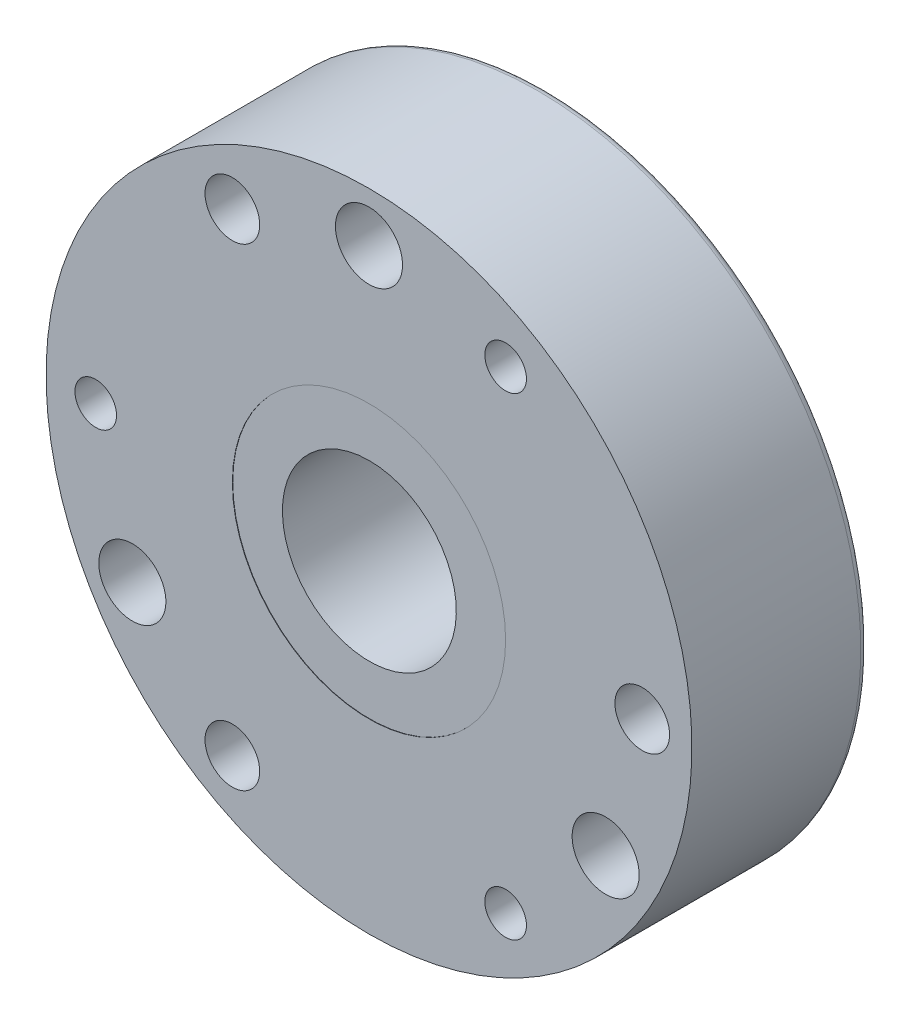
ISO-10303-21;
HEADER;
FILE_DESCRIPTION(('STEP AP214'),'2;1');
FILE_NAME('part.step','',(''),(''),'','','');
FILE_SCHEMA(('AUTOMOTIVE_DESIGN { 1 0 10303 214 1 1 1 1 }'));
ENDSEC;
DATA;
#1=APPLICATION_CONTEXT('core data for automotive mechanical design processes');
#2=APPLICATION_PROTOCOL_DEFINITION('international standard','automotive_design',2000,#1);
#3=PRODUCT_CONTEXT('',#1,'mechanical');
#4=PRODUCT('Part','Part','',(#3));
#5=PRODUCT_RELATED_PRODUCT_CATEGORY('part','',(#4));
#6=PRODUCT_DEFINITION_FORMATION('','',#4);
#7=PRODUCT_DEFINITION_CONTEXT('part definition',#1,'design');
#8=PRODUCT_DEFINITION('design','',#6,#7);
#9=PRODUCT_DEFINITION_SHAPE('','',#8);
#10=(LENGTH_UNIT() NAMED_UNIT(*) SI_UNIT(.MILLI.,.METRE.));
#11=(NAMED_UNIT(*) PLANE_ANGLE_UNIT() SI_UNIT($,.RADIAN.));
#12=(NAMED_UNIT(*) SI_UNIT($,.STERADIAN.) SOLID_ANGLE_UNIT());
#13=UNCERTAINTY_MEASURE_WITH_UNIT(LENGTH_MEASURE(1.E-05),#10,'distance_accuracy_value','');
#14=(GEOMETRIC_REPRESENTATION_CONTEXT(3) GLOBAL_UNCERTAINTY_ASSIGNED_CONTEXT((#13)) GLOBAL_UNIT_ASSIGNED_CONTEXT((#10,
#11,#12)) REPRESENTATION_CONTEXT('',''));
#15=CARTESIAN_POINT('',(0.,0.,0.));
#16=DIRECTION('',(0.,0.,1.));
#17=DIRECTION('',(1.,0.,0.));
#18=AXIS2_PLACEMENT_3D('',#15,#16,#17);
#19=CARTESIAN_POINT('',(0.,-14.35,6.85));
#20=DIRECTION('',(0.,0.,1.));
#21=DIRECTION('',(1.,0.,0.));
#22=AXIS2_PLACEMENT_3D('',#19,#20,#21);
#23=PLANE('',#22);
#24=CARTESIAN_POINT('',(0.,-1.35,6.85));
#25=DIRECTION('',(0.,0.,1.));
#26=DIRECTION('',(0.,-1.,0.));
#27=AXIS2_PLACEMENT_3D('',#24,#25,#26);
#28=CIRCLE('',#27,13.);
#29=CARTESIAN_POINT('',(0.,-14.35,6.85));
#30=VERTEX_POINT('',#29);
#31=EDGE_CURVE('E56',#30,#30,#28,.T.);
#32=ORIENTED_EDGE('',*,*,#31,.T.);
#33=EDGE_LOOP('',(#32));
#34=FACE_BOUND('',#33,.T.);
#35=CARTESIAN_POINT('',(0.,-1.35,6.85));
#36=DIRECTION('',(0.,0.,-1.));
#37=DIRECTION('',(-1.,0.,0.));
#38=AXIS2_PLACEMENT_3D('',#35,#36,#37);
#39=CIRCLE('',#38,5.5);
#40=CARTESIAN_POINT('',(-5.50000000000003,-1.35,6.85));
#41=VERTEX_POINT('',#40);
#42=EDGE_CURVE('E10',#41,#41,#39,.T.);
#43=ORIENTED_EDGE('',*,*,#42,.T.);
#44=EDGE_LOOP('',(#43));
#45=FACE_BOUND('',#44,.T.);
#46=CARTESIAN_POINT('',(-9.526279441629,-6.85,6.85));
#47=DIRECTION('',(0.,0.,-1.));
#48=DIRECTION('',(0.,1.,0.));
#49=AXIS2_PLACEMENT_3D('',#46,#47,#48);
#50=CIRCLE('',#49,1.35);
#51=CARTESIAN_POINT('',(-9.526279441629,-5.5,6.85));
#52=VERTEX_POINT('',#51);
#53=EDGE_CURVE('E95',#52,#52,#50,.T.);
#54=ORIENTED_EDGE('',*,*,#53,.T.);
#55=EDGE_LOOP('',(#54));
#56=FACE_BOUND('',#55,.T.);
#57=CARTESIAN_POINT('',(0.,9.65,6.85));
#58=DIRECTION('',(0.,0.,-1.));
#59=DIRECTION('',(0.,1.,0.));
#60=AXIS2_PLACEMENT_3D('',#57,#58,#59);
#61=CIRCLE('',#60,1.35);
#62=CARTESIAN_POINT('',(0.,11.,6.85));
#63=VERTEX_POINT('',#62);
#64=EDGE_CURVE('E104',#63,#63,#61,.T.);
#65=ORIENTED_EDGE('',*,*,#64,.T.);
#66=EDGE_LOOP('',(#65));
#67=FACE_BOUND('',#66,.T.);
#68=CARTESIAN_POINT('',(9.526279441629,-6.85,6.85));
#69=DIRECTION('',(0.,0.,-1.));
#70=DIRECTION('',(0.,1.,0.));
#71=AXIS2_PLACEMENT_3D('',#68,#69,#70);
#72=CIRCLE('',#71,1.35);
#73=CARTESIAN_POINT('',(9.526279441629,-5.5,6.85));
#74=VERTEX_POINT('',#73);
#75=EDGE_CURVE('E112',#74,#74,#72,.T.);
#76=ORIENTED_EDGE('',*,*,#75,.T.);
#77=EDGE_LOOP('',(#76));
#78=FACE_BOUND('',#77,.T.);
#79=CARTESIAN_POINT('',(-11.,-1.35,6.85));
#80=DIRECTION('',(0.,0.,-1.));
#81=DIRECTION('',(0.,1.,0.));
#82=AXIS2_PLACEMENT_3D('',#79,#80,#81);
#83=CIRCLE('',#82,0.8376);
#84=CARTESIAN_POINT('',(-11.,-0.5124,6.85));
#85=VERTEX_POINT('',#84);
#86=EDGE_CURVE('E91',#85,#85,#83,.T.);
#87=ORIENTED_EDGE('',*,*,#86,.T.);
#88=EDGE_LOOP('',(#87));
#89=FACE_BOUND('',#88,.T.);
#90=CARTESIAN_POINT('',(5.5,-10.87627944163,6.85));
#91=DIRECTION('',(0.,0.,-1.));
#92=DIRECTION('',(0.,1.,0.));
#93=AXIS2_PLACEMENT_3D('',#90,#91,#92);
#94=CIRCLE('',#93,0.8376);
#95=CARTESIAN_POINT('',(5.5,-10.03867944163,6.85));
#96=VERTEX_POINT('',#95);
#97=EDGE_CURVE('E80',#96,#96,#94,.T.);
#98=ORIENTED_EDGE('',*,*,#97,.T.);
#99=EDGE_LOOP('',(#98));
#100=FACE_BOUND('',#99,.T.);
#101=CARTESIAN_POINT('',(5.5,8.176279441629,6.85));
#102=DIRECTION('',(0.,0.,-1.));
#103=DIRECTION('',(0.,1.,0.));
#104=AXIS2_PLACEMENT_3D('',#101,#102,#103);
#105=CIRCLE('',#104,0.8376);
#106=CARTESIAN_POINT('',(5.5,9.013879441629,6.85));
#107=VERTEX_POINT('',#106);
#108=EDGE_CURVE('E71',#107,#107,#105,.T.);
#109=ORIENTED_EDGE('',*,*,#108,.T.);
#110=EDGE_LOOP('',(#109));
#111=FACE_BOUND('',#110,.T.);
#112=CARTESIAN_POINT('',(-5.5,8.176279441629,6.85));
#113=DIRECTION('',(0.,0.,-1.));
#114=DIRECTION('',(0.,1.,0.));
#115=AXIS2_PLACEMENT_3D('',#112,#113,#114);
#116=CIRCLE('',#115,1.1);
#117=CARTESIAN_POINT('',(-5.5,9.276279441629,6.85));
#118=VERTEX_POINT('',#117);
#119=EDGE_CURVE('E99',#118,#118,#116,.T.);
#120=ORIENTED_EDGE('',*,*,#119,.T.);
#121=EDGE_LOOP('',(#120));
#122=FACE_BOUND('',#121,.T.);
#123=CARTESIAN_POINT('',(-5.5,-10.87627944163,6.85));
#124=DIRECTION('',(0.,0.,-1.));
#125=DIRECTION('',(0.,1.,0.));
#126=AXIS2_PLACEMENT_3D('',#123,#124,#125);
#127=CIRCLE('',#126,1.1);
#128=CARTESIAN_POINT('',(-5.5,-9.77627944163,6.85));
#129=VERTEX_POINT('',#128);
#130=EDGE_CURVE('E65',#129,#129,#127,.T.);
#131=ORIENTED_EDGE('',*,*,#130,.T.);
#132=EDGE_LOOP('',(#131));
#133=FACE_BOUND('',#132,.T.);
#134=CARTESIAN_POINT('',(11.,-1.35,6.85));
#135=DIRECTION('',(0.,0.,-1.));
#136=DIRECTION('',(0.,1.,0.));
#137=AXIS2_PLACEMENT_3D('',#134,#135,#136);
#138=CIRCLE('',#137,1.1);
#139=CARTESIAN_POINT('',(11.,-0.25,6.85));
#140=VERTEX_POINT('',#139);
#141=EDGE_CURVE('E64',#140,#140,#138,.T.);
#142=ORIENTED_EDGE('',*,*,#141,.T.);
#143=EDGE_LOOP('',(#142));
#144=FACE_BOUND('',#143,.T.);
#145=ADVANCED_FACE('F14',(#34,#45,#56,#67,#78,#89,#100,#111,#122,#133,#144),#23,.T.);
#146=CARTESIAN_POINT('',(0.,-1.35,6.85));
#147=DIRECTION('',(0.,0.,1.));
#148=DIRECTION('',(1.,0.,0.));
#149=AXIS2_PLACEMENT_3D('',#146,#147,#148);
#150=CYLINDRICAL_SURFACE('',#149,5.5);
#151=ORIENTED_EDGE('',*,*,#42,.F.);
#152=EDGE_LOOP('',(#151));
#153=FACE_BOUND('',#152,.T.);
#154=CARTESIAN_POINT('',(0.,-1.35,6.835));
#155=DIRECTION('',(0.,0.,-1.));
#156=DIRECTION('',(1.,0.,0.));
#157=AXIS2_PLACEMENT_3D('',#154,#155,#156);
#158=CIRCLE('',#157,5.5);
#159=CARTESIAN_POINT('',(5.49999999999997,-1.35,6.835));
#160=VERTEX_POINT('',#159);
#161=EDGE_CURVE('E22',#160,#160,#158,.T.);
#162=ORIENTED_EDGE('',*,*,#161,.T.);
#163=EDGE_LOOP('',(#162));
#164=FACE_BOUND('',#163,.T.);
#165=ADVANCED_FACE('F16',(#153,#164),#150,.F.);
#166=CARTESIAN_POINT('',(0.,-6.85,6.835));
#167=DIRECTION('',(0.,0.,1.));
#168=DIRECTION('',(1.,0.,0.));
#169=AXIS2_PLACEMENT_3D('',#166,#167,#168);
#170=PLANE('',#169);
#171=ORIENTED_EDGE('',*,*,#161,.F.);
#172=EDGE_LOOP('',(#171));
#173=FACE_BOUND('',#172,.T.);
#174=CARTESIAN_POINT('',(0.,-1.35,6.835));
#175=DIRECTION('',(0.,0.,-1.));
#176=DIRECTION('',(0.,1.,0.));
#177=AXIS2_PLACEMENT_3D('',#174,#175,#176);
#178=CIRCLE('',#177,3.5);
#179=CARTESIAN_POINT('',(0.,2.15,6.835));
#180=VERTEX_POINT('',#179);
#181=EDGE_CURVE('E31',#180,#180,#178,.T.);
#182=ORIENTED_EDGE('',*,*,#181,.T.);
#183=EDGE_LOOP('',(#182));
#184=FACE_BOUND('',#183,.T.);
#185=ADVANCED_FACE('F212',(#173,#184),#170,.T.);
#186=CARTESIAN_POINT('',(0.,-1.35,-9.244714828897));
#187=DIRECTION('',(0.,0.,-1.));
#188=DIRECTION('',(0.,-1.,0.));
#189=AXIS2_PLACEMENT_3D('',#186,#187,#188);
#190=CYLINDRICAL_SURFACE('',#189,3.5);
#191=CARTESIAN_POINT('',(0.,-1.35,0.05));
#192=DIRECTION('',(0.,0.,1.));
#193=DIRECTION('',(0.,1.,0.));
#194=AXIS2_PLACEMENT_3D('',#191,#192,#193);
#195=CIRCLE('',#194,3.5);
#196=CARTESIAN_POINT('',(0.,2.15,0.05));
#197=VERTEX_POINT('',#196);
#198=EDGE_CURVE('E38',#197,#197,#195,.T.);
#199=ORIENTED_EDGE('',*,*,#198,.F.);
#200=EDGE_LOOP('',(#199));
#201=FACE_BOUND('',#200,.T.);
#202=ORIENTED_EDGE('',*,*,#181,.F.);
#203=EDGE_LOOP('',(#202));
#204=FACE_BOUND('',#203,.T.);
#205=ADVANCED_FACE('F209',(#201,#204),#190,.F.);
#206=CARTESIAN_POINT('',(0.,-1.35,0.05));
#207=DIRECTION('',(0.,0.,-1.));
#208=DIRECTION('',(0.,-1.,0.));
#209=AXIS2_PLACEMENT_3D('',#206,#207,#208);
#210=TOROIDAL_SURFACE('',#209,3.8,0.3);
#211=ORIENTED_EDGE('',*,*,#198,.T.);
#212=EDGE_LOOP('',(#211));
#213=FACE_BOUND('',#212,.T.);
#214=CARTESIAN_POINT('',(0.,-1.35,-0.25));
#215=DIRECTION('',(0.,0.,1.));
#216=DIRECTION('',(0.,-1.,0.));
#217=AXIS2_PLACEMENT_3D('',#214,#215,#216);
#218=CIRCLE('',#217,3.8);
#219=CARTESIAN_POINT('',(0.,-5.15,-0.25));
#220=VERTEX_POINT('',#219);
#221=EDGE_CURVE('E44',#220,#220,#218,.T.);
#222=ORIENTED_EDGE('',*,*,#221,.F.);
#223=EDGE_LOOP('',(#222));
#224=FACE_BOUND('',#223,.T.);
#225=ADVANCED_FACE('F197',(#213,#224),#210,.T.);
#226=CARTESIAN_POINT('',(0.,-4.85,-0.25));
#227=DIRECTION('',(0.,0.,-1.));
#228=DIRECTION('',(0.,-1.,0.));
#229=AXIS2_PLACEMENT_3D('',#226,#227,#228);
#230=PLANE('',#229);
#231=CARTESIAN_POINT('',(0.,-1.35,-0.25));
#232=DIRECTION('',(0.,0.,-1.));
#233=DIRECTION('',(0.,1.,0.));
#234=AXIS2_PLACEMENT_3D('',#231,#232,#233);
#235=CIRCLE('',#234,12.7);
#236=CARTESIAN_POINT('',(0.,11.35,-0.25));
#237=VERTEX_POINT('',#236);
#238=EDGE_CURVE('E48',#237,#237,#235,.T.);
#239=ORIENTED_EDGE('',*,*,#238,.T.);
#240=EDGE_LOOP('',(#239));
#241=FACE_BOUND('',#240,.T.);
#242=ORIENTED_EDGE('',*,*,#221,.T.);
#243=EDGE_LOOP('',(#242));
#244=FACE_BOUND('',#243,.T.);
#245=CARTESIAN_POINT('',(11.,-1.35,-0.25));
#246=DIRECTION('',(0.,0.,1.));
#247=DIRECTION('',(0.,-1.,0.));
#248=AXIS2_PLACEMENT_3D('',#245,#246,#247);
#249=CIRCLE('',#248,1.1);
#250=CARTESIAN_POINT('',(11.,-2.45,-0.25));
#251=VERTEX_POINT('',#250);
#252=EDGE_CURVE('E60',#251,#251,#249,.T.);
#253=ORIENTED_EDGE('',*,*,#252,.T.);
#254=EDGE_LOOP('',(#253));
#255=FACE_BOUND('',#254,.T.);
#256=CARTESIAN_POINT('',(-5.5,-10.87627944163,-0.25));
#257=DIRECTION('',(0.,0.,1.));
#258=DIRECTION('',(0.,-1.,0.));
#259=AXIS2_PLACEMENT_3D('',#256,#257,#258);
#260=CIRCLE('',#259,1.1);
#261=CARTESIAN_POINT('',(-5.5,-11.97627944163,-0.25));
#262=VERTEX_POINT('',#261);
#263=EDGE_CURVE('E69',#262,#262,#260,.T.);
#264=ORIENTED_EDGE('',*,*,#263,.T.);
#265=EDGE_LOOP('',(#264));
#266=FACE_BOUND('',#265,.T.);
#267=CARTESIAN_POINT('',(-5.5,8.176279441629,-0.25));
#268=DIRECTION('',(0.,0.,1.));
#269=DIRECTION('',(0.,-1.,0.));
#270=AXIS2_PLACEMENT_3D('',#267,#268,#269);
#271=CIRCLE('',#270,1.1);
#272=CARTESIAN_POINT('',(-5.5,7.076279441629,-0.25));
#273=VERTEX_POINT('',#272);
#274=EDGE_CURVE('E70',#273,#273,#271,.T.);
#275=ORIENTED_EDGE('',*,*,#274,.T.);
#276=EDGE_LOOP('',(#275));
#277=FACE_BOUND('',#276,.T.);
#278=CARTESIAN_POINT('',(5.5,8.176279441629,-0.25));
#279=DIRECTION('',(0.,0.,1.));
#280=DIRECTION('',(0.,-1.,0.));
#281=AXIS2_PLACEMENT_3D('',#278,#279,#280);
#282=CIRCLE('',#281,0.8376);
#283=CARTESIAN_POINT('',(5.5,7.338679441629,-0.25));
#284=VERTEX_POINT('',#283);
#285=EDGE_CURVE('E75',#284,#284,#282,.T.);
#286=ORIENTED_EDGE('',*,*,#285,.T.);
#287=EDGE_LOOP('',(#286));
#288=FACE_BOUND('',#287,.T.);
#289=CARTESIAN_POINT('',(5.5,-10.87627944163,-0.25));
#290=DIRECTION('',(0.,0.,1.));
#291=DIRECTION('',(0.,-1.,0.));
#292=AXIS2_PLACEMENT_3D('',#289,#290,#291);
#293=CIRCLE('',#292,0.8376);
#294=CARTESIAN_POINT('',(5.5,-11.71387944163,-0.25));
#295=VERTEX_POINT('',#294);
#296=EDGE_CURVE('E76',#295,#295,#293,.T.);
#297=ORIENTED_EDGE('',*,*,#296,.T.);
#298=EDGE_LOOP('',(#297));
#299=FACE_BOUND('',#298,.T.);
#300=CARTESIAN_POINT('',(-11.,-1.35,-0.25));
#301=DIRECTION('',(0.,0.,1.));
#302=DIRECTION('',(0.,-1.,0.));
#303=AXIS2_PLACEMENT_3D('',#300,#301,#302);
#304=CIRCLE('',#303,0.8376);
#305=CARTESIAN_POINT('',(-11.,-2.1876,-0.25));
#306=VERTEX_POINT('',#305);
#307=EDGE_CURVE('E84',#306,#306,#304,.T.);
#308=ORIENTED_EDGE('',*,*,#307,.T.);
#309=EDGE_LOOP('',(#308));
#310=FACE_BOUND('',#309,.T.);
#311=ADVANCED_FACE('F195',(#241,#244,#255,#266,#277,#288,#299,#310),#230,.T.);
#312=CARTESIAN_POINT('',(0.,-1.35,0.05));
#313=DIRECTION('',(0.,0.,-1.));
#314=DIRECTION('',(0.,-1.,0.));
#315=AXIS2_PLACEMENT_3D('',#312,#313,#314);
#316=TOROIDAL_SURFACE('',#315,12.7,0.3);
#317=ORIENTED_EDGE('',*,*,#238,.F.);
#318=EDGE_LOOP('',(#317));
#319=FACE_BOUND('',#318,.T.);
#320=CARTESIAN_POINT('',(0.,-1.35,0.05));
#321=DIRECTION('',(0.,0.,-1.));
#322=DIRECTION('',(0.,-1.,0.));
#323=AXIS2_PLACEMENT_3D('',#320,#321,#322);
#324=CIRCLE('',#323,13.);
#325=CARTESIAN_POINT('',(0.,-14.35,0.05));
#326=VERTEX_POINT('',#325);
#327=EDGE_CURVE('E52',#326,#326,#324,.T.);
#328=ORIENTED_EDGE('',*,*,#327,.T.);
#329=EDGE_LOOP('',(#328));
#330=FACE_BOUND('',#329,.T.);
#331=ADVANCED_FACE('F174',(#319,#330),#316,.T.);
#332=CARTESIAN_POINT('',(0.,-1.35,-9.244714828897));
#333=DIRECTION('',(0.,0.,-1.));
#334=DIRECTION('',(0.,-1.,0.));
#335=AXIS2_PLACEMENT_3D('',#332,#333,#334);
#336=CYLINDRICAL_SURFACE('',#335,13.);
#337=ORIENTED_EDGE('',*,*,#327,.F.);
#338=EDGE_LOOP('',(#337));
#339=FACE_BOUND('',#338,.T.);
#340=ORIENTED_EDGE('',*,*,#31,.F.);
#341=EDGE_LOOP('',(#340));
#342=FACE_BOUND('',#341,.T.);
#343=ADVANCED_FACE('F163',(#339,#342),#336,.T.);
#344=CARTESIAN_POINT('',(11.,-1.35,6.85));
#345=DIRECTION('',(0.,0.,-1.));
#346=DIRECTION('',(0.,-1.,0.));
#347=AXIS2_PLACEMENT_3D('',#344,#345,#346);
#348=CYLINDRICAL_SURFACE('',#347,1.1);
#349=ORIENTED_EDGE('',*,*,#252,.F.);
#350=EDGE_LOOP('',(#349));
#351=FACE_BOUND('',#350,.T.);
#352=ORIENTED_EDGE('',*,*,#141,.F.);
#353=EDGE_LOOP('',(#352));
#354=FACE_BOUND('',#353,.T.);
#355=ADVANCED_FACE('F160',(#351,#354),#348,.F.);
#356=CARTESIAN_POINT('',(-5.5,-10.87627944163,6.85));
#357=DIRECTION('',(0.,0.,-1.));
#358=DIRECTION('',(0.,-1.,0.));
#359=AXIS2_PLACEMENT_3D('',#356,#357,#358);
#360=CYLINDRICAL_SURFACE('',#359,1.1);
#361=ORIENTED_EDGE('',*,*,#263,.F.);
#362=EDGE_LOOP('',(#361));
#363=FACE_BOUND('',#362,.T.);
#364=ORIENTED_EDGE('',*,*,#130,.F.);
#365=EDGE_LOOP('',(#364));
#366=FACE_BOUND('',#365,.T.);
#367=ADVANCED_FACE('F162',(#363,#366),#360,.F.);
#368=CARTESIAN_POINT('',(-5.5,8.176279441629,6.85));
#369=DIRECTION('',(0.,0.,-1.));
#370=DIRECTION('',(0.,-1.,0.));
#371=AXIS2_PLACEMENT_3D('',#368,#369,#370);
#372=CYLINDRICAL_SURFACE('',#371,1.1);
#373=ORIENTED_EDGE('',*,*,#274,.F.);
#374=EDGE_LOOP('',(#373));
#375=FACE_BOUND('',#374,.T.);
#376=ORIENTED_EDGE('',*,*,#119,.F.);
#377=EDGE_LOOP('',(#376));
#378=FACE_BOUND('',#377,.T.);
#379=ADVANCED_FACE('F171',(#375,#378),#372,.F.);
#380=CARTESIAN_POINT('',(5.5,8.176279441629,6.85));
#381=DIRECTION('',(0.,0.,-1.));
#382=DIRECTION('',(0.,-1.,0.));
#383=AXIS2_PLACEMENT_3D('',#380,#381,#382);
#384=CYLINDRICAL_SURFACE('',#383,0.8376);
#385=ORIENTED_EDGE('',*,*,#285,.F.);
#386=EDGE_LOOP('',(#385));
#387=FACE_BOUND('',#386,.T.);
#388=ORIENTED_EDGE('',*,*,#108,.F.);
#389=EDGE_LOOP('',(#388));
#390=FACE_BOUND('',#389,.T.);
#391=ADVANCED_FACE('F200',(#387,#390),#384,.F.);
#392=CARTESIAN_POINT('',(5.5,-10.87627944163,6.85));
#393=DIRECTION('',(0.,0.,-1.));
#394=DIRECTION('',(0.,-1.,0.));
#395=AXIS2_PLACEMENT_3D('',#392,#393,#394);
#396=CYLINDRICAL_SURFACE('',#395,0.8376);
#397=ORIENTED_EDGE('',*,*,#296,.F.);
#398=EDGE_LOOP('',(#397));
#399=FACE_BOUND('',#398,.T.);
#400=ORIENTED_EDGE('',*,*,#97,.F.);
#401=EDGE_LOOP('',(#400));
#402=FACE_BOUND('',#401,.T.);
#403=ADVANCED_FACE('F192',(#399,#402),#396,.F.);
#404=CARTESIAN_POINT('',(-11.,-1.35,6.85));
#405=DIRECTION('',(0.,0.,-1.));
#406=DIRECTION('',(0.,-1.,0.));
#407=AXIS2_PLACEMENT_3D('',#404,#405,#406);
#408=CYLINDRICAL_SURFACE('',#407,0.8376);
#409=ORIENTED_EDGE('',*,*,#307,.F.);
#410=EDGE_LOOP('',(#409));
#411=FACE_BOUND('',#410,.T.);
#412=ORIENTED_EDGE('',*,*,#86,.F.);
#413=EDGE_LOOP('',(#412));
#414=FACE_BOUND('',#413,.T.);
#415=ADVANCED_FACE('F189',(#411,#414),#408,.F.);
#416=CARTESIAN_POINT('',(-9.526279441629,-6.85,6.85));
#417=DIRECTION('',(0.,0.,-1.));
#418=DIRECTION('',(0.,-1.,0.));
#419=AXIS2_PLACEMENT_3D('',#416,#417,#418);
#420=CYLINDRICAL_SURFACE('',#419,1.35);
#421=CARTESIAN_POINT('',(-9.526279441629,-6.85,1.85));
#422=DIRECTION('',(0.,0.,1.));
#423=DIRECTION('',(0.,1.,0.));
#424=AXIS2_PLACEMENT_3D('',#421,#422,#423);
#425=CIRCLE('',#424,1.35);
#426=CARTESIAN_POINT('',(-9.526279441629,-5.5,1.85));
#427=VERTEX_POINT('',#426);
#428=EDGE_CURVE('E100',#427,#427,#425,.T.);
#429=ORIENTED_EDGE('',*,*,#428,.F.);
#430=EDGE_LOOP('',(#429));
#431=FACE_BOUND('',#430,.T.);
#432=ORIENTED_EDGE('',*,*,#53,.F.);
#433=EDGE_LOOP('',(#432));
#434=FACE_BOUND('',#433,.T.);
#435=ADVANCED_FACE('F184',(#431,#434),#420,.F.);
#436=CARTESIAN_POINT('',(-9.526279441629,-6.85,1.85));
#437=DIRECTION('',(0.,0.,-1.));
#438=DIRECTION('',(0.,-1.,0.));
#439=AXIS2_PLACEMENT_3D('',#436,#437,#438);
#440=PLANE('',#439);
#441=ORIENTED_EDGE('',*,*,#428,.T.);
#442=EDGE_LOOP('',(#441));
#443=FACE_BOUND('',#442,.T.);
#444=ADVANCED_FACE('F182',(#443),#440,.F.);
#445=CARTESIAN_POINT('',(0.,9.65,6.85));
#446=DIRECTION('',(0.,0.,-1.));
#447=DIRECTION('',(0.,-1.,0.));
#448=AXIS2_PLACEMENT_3D('',#445,#446,#447);
#449=CYLINDRICAL_SURFACE('',#448,1.35);
#450=CARTESIAN_POINT('',(0.,9.65,1.85));
#451=DIRECTION('',(0.,0.,1.));
#452=DIRECTION('',(-1.,0.,0.));
#453=AXIS2_PLACEMENT_3D('',#450,#451,#452);
#454=CIRCLE('',#453,1.35);
#455=CARTESIAN_POINT('',(-1.35000000000003,9.65,1.85));
#456=VERTEX_POINT('',#455);
#457=EDGE_CURVE('E108',#456,#456,#454,.T.);
#458=ORIENTED_EDGE('',*,*,#457,.F.);
#459=EDGE_LOOP('',(#458));
#460=FACE_BOUND('',#459,.T.);
#461=ORIENTED_EDGE('',*,*,#64,.F.);
#462=EDGE_LOOP('',(#461));
#463=FACE_BOUND('',#462,.T.);
#464=ADVANCED_FACE('F180',(#460,#463),#449,.F.);
#465=CARTESIAN_POINT('',(-9.526279441629,-6.85,1.85));
#466=DIRECTION('',(0.,0.,-1.));
#467=DIRECTION('',(0.,-1.,0.));
#468=AXIS2_PLACEMENT_3D('',#465,#466,#467);
#469=PLANE('',#468);
#470=ORIENTED_EDGE('',*,*,#457,.T.);
#471=EDGE_LOOP('',(#470));
#472=FACE_BOUND('',#471,.T.);
#473=ADVANCED_FACE('F140',(#472),#469,.F.);
#474=CARTESIAN_POINT('',(9.526279441629,-6.85,6.85));
#475=DIRECTION('',(0.,0.,-1.));
#476=DIRECTION('',(0.,-1.,0.));
#477=AXIS2_PLACEMENT_3D('',#474,#475,#476);
#478=CYLINDRICAL_SURFACE('',#477,1.35);
#479=CARTESIAN_POINT('',(9.526279441629,-6.85,1.85));
#480=DIRECTION('',(0.,0.,1.));
#481=DIRECTION('',(-1.,0.,0.));
#482=AXIS2_PLACEMENT_3D('',#479,#480,#481);
#483=CIRCLE('',#482,1.35);
#484=CARTESIAN_POINT('',(8.176279441629,-6.85,1.85));
#485=VERTEX_POINT('',#484);
#486=EDGE_CURVE('E122',#485,#485,#483,.T.);
#487=ORIENTED_EDGE('',*,*,#486,.F.);
#488=EDGE_LOOP('',(#487));
#489=FACE_BOUND('',#488,.T.);
#490=ORIENTED_EDGE('',*,*,#75,.F.);
#491=EDGE_LOOP('',(#490));
#492=FACE_BOUND('',#491,.T.);
#493=ADVANCED_FACE('F137',(#489,#492),#478,.F.);
#494=CARTESIAN_POINT('',(-9.526279441629,-6.85,1.85));
#495=DIRECTION('',(0.,0.,-1.));
#496=DIRECTION('',(0.,-1.,0.));
#497=AXIS2_PLACEMENT_3D('',#494,#495,#496);
#498=PLANE('',#497);
#499=ORIENTED_EDGE('',*,*,#486,.T.);
#500=EDGE_LOOP('',(#499));
#501=FACE_BOUND('',#500,.T.);
#502=ADVANCED_FACE('F135',(#501),#498,.F.);
#503=CLOSED_SHELL('',(#145,#165,#185,#205,#225,#311,#331,#343,#355,#367,#379,#391,#403,#415,
#435,#444,#464,#473,#493,#502));
#504=MANIFOLD_SOLID_BREP('B1',#503);
#505=ADVANCED_BREP_SHAPE_REPRESENTATION('',(#18,#504),#14);
#506=SHAPE_DEFINITION_REPRESENTATION(#9,#505);
ENDSEC;
END-ISO-10303-21;
